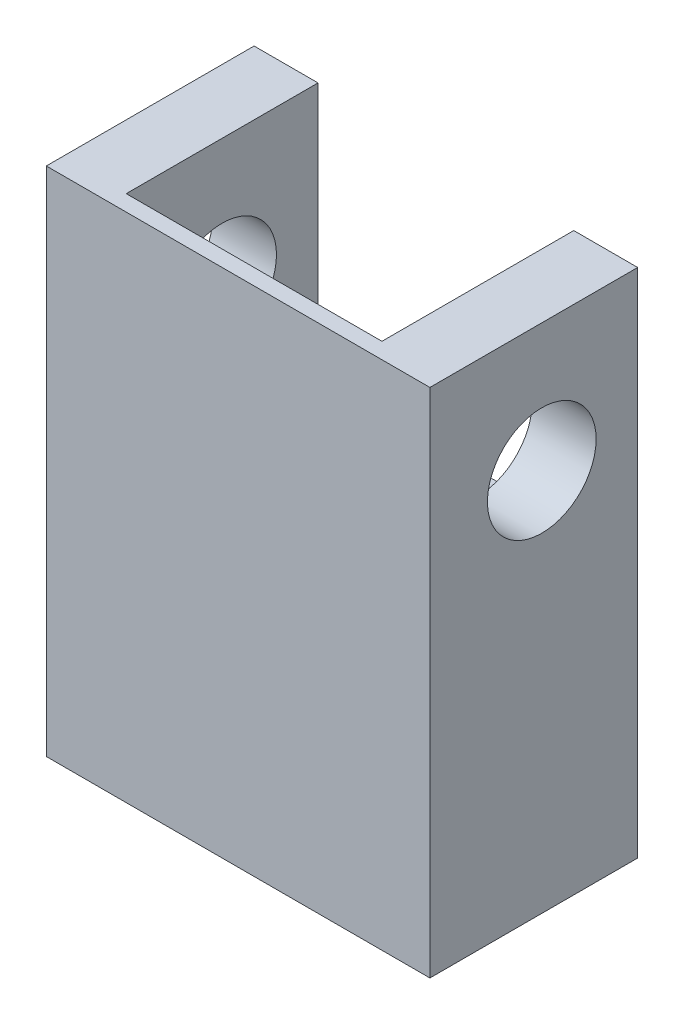
ISO-10303-21;
HEADER;
FILE_DESCRIPTION(('STEP AP214'),'2;1');
FILE_NAME('part.step','',(''),(''),'','','');
FILE_SCHEMA(('AUTOMOTIVE_DESIGN { 1 0 10303 214 1 1 1 1 }'));
ENDSEC;
DATA;
#1=APPLICATION_CONTEXT('core data for automotive mechanical design processes');
#2=APPLICATION_PROTOCOL_DEFINITION('international standard','automotive_design',2000,#1);
#3=PRODUCT_CONTEXT('',#1,'mechanical');
#4=PRODUCT('Part','Part','',(#3));
#5=PRODUCT_RELATED_PRODUCT_CATEGORY('part','',(#4));
#6=PRODUCT_DEFINITION_FORMATION('','',#4);
#7=PRODUCT_DEFINITION_CONTEXT('part definition',#1,'design');
#8=PRODUCT_DEFINITION('design','',#6,#7);
#9=PRODUCT_DEFINITION_SHAPE('','',#8);
#10=(LENGTH_UNIT() NAMED_UNIT(*) SI_UNIT(.MILLI.,.METRE.));
#11=(NAMED_UNIT(*) PLANE_ANGLE_UNIT() SI_UNIT($,.RADIAN.));
#12=(NAMED_UNIT(*) SI_UNIT($,.STERADIAN.) SOLID_ANGLE_UNIT());
#13=UNCERTAINTY_MEASURE_WITH_UNIT(LENGTH_MEASURE(1.E-05),#10,'distance_accuracy_value','');
#14=(GEOMETRIC_REPRESENTATION_CONTEXT(3) GLOBAL_UNCERTAINTY_ASSIGNED_CONTEXT((#13)) GLOBAL_UNIT_ASSIGNED_CONTEXT((#10,
#11,#12)) REPRESENTATION_CONTEXT('',''));
#15=CARTESIAN_POINT('',(0.,0.,0.));
#16=DIRECTION('',(0.,0.,1.));
#17=DIRECTION('',(1.,0.,0.));
#18=AXIS2_PLACEMENT_3D('',#15,#16,#17);
#19=CARTESIAN_POINT('',(38.1,0.,19.05));
#20=DIRECTION('',(-1.,0.,0.));
#21=DIRECTION('',(0.,-1.,0.));
#22=AXIS2_PLACEMENT_3D('',#19,#20,#21);
#23=PLANE('',#22);
#24=CARTESIAN_POINT('',(38.1,76.2,0.));
#25=DIRECTION('',(1.,0.,0.));
#26=DIRECTION('',(0.,0.,-1.));
#27=AXIS2_PLACEMENT_3D('',#24,#25,#26);
#28=CIRCLE('',#27,10.795);
#29=CARTESIAN_POINT('',(38.1,76.2,-10.795));
#30=VERTEX_POINT('',#29);
#31=EDGE_CURVE('E130',#30,#30,#28,.T.);
#32=ORIENTED_EDGE('',*,*,#31,.F.);
#33=EDGE_LOOP('',(#32));
#34=FACE_BOUND('',#33,.T.);
#35=DIRECTION('',(0.,1.,0.));
#36=VECTOR('',#35,1.);
#37=CARTESIAN_POINT('',(38.1,0.,-19.05));
#38=LINE('',#37,#36);
#39=CARTESIAN_POINT('',(38.1,0.,-19.05));
#40=VERTEX_POINT('',#39);
#41=CARTESIAN_POINT('',(38.1,101.6,-19.05));
#42=VERTEX_POINT('',#41);
#43=EDGE_CURVE('E143',#40,#42,#38,.T.);
#44=ORIENTED_EDGE('',*,*,#43,.T.);
#45=DIRECTION('',(0.,0.,-1.));
#46=VECTOR('',#45,1.);
#47=CARTESIAN_POINT('',(38.1,101.6,19.05));
#48=LINE('',#47,#46);
#49=CARTESIAN_POINT('',(38.1,101.6,22.225));
#50=VERTEX_POINT('',#49);
#51=EDGE_CURVE('E11',#50,#42,#48,.T.);
#52=ORIENTED_EDGE('',*,*,#51,.F.);
#53=DIRECTION('',(0.,1.,0.));
#54=VECTOR('',#53,1.);
#55=CARTESIAN_POINT('',(38.1,101.6,22.225));
#56=LINE('',#55,#54);
#57=CARTESIAN_POINT('',(38.1,0.,22.225));
#58=VERTEX_POINT('',#57);
#59=EDGE_CURVE('E119',#58,#50,#56,.T.);
#60=ORIENTED_EDGE('',*,*,#59,.F.);
#61=DIRECTION('',(0.,0.,-1.));
#62=VECTOR('',#61,1.);
#63=CARTESIAN_POINT('',(38.1,0.,19.05));
#64=LINE('',#63,#62);
#65=EDGE_CURVE('E111',#58,#40,#64,.T.);
#66=ORIENTED_EDGE('',*,*,#65,.T.);
#67=EDGE_LOOP('',(#44,#52,#60,#66));
#68=FACE_BOUND('',#67,.T.);
#69=ADVANCED_FACE('F33',(#34,#68),#23,.F.);
#70=CARTESIAN_POINT('',(25.4,101.6,19.05));
#71=DIRECTION('',(1.,0.,0.));
#72=DIRECTION('',(0.,0.,-1.));
#73=AXIS2_PLACEMENT_3D('',#70,#71,#72);
#74=PLANE('',#73);
#75=CARTESIAN_POINT('',(25.4,76.2,0.));
#76=DIRECTION('',(1.,0.,0.));
#77=DIRECTION('',(0.,0.,-1.));
#78=AXIS2_PLACEMENT_3D('',#75,#76,#77);
#79=CIRCLE('',#78,10.795);
#80=CARTESIAN_POINT('',(25.4,76.2,-10.795));
#81=VERTEX_POINT('',#80);
#82=EDGE_CURVE('E140',#81,#81,#79,.T.);
#83=ORIENTED_EDGE('',*,*,#82,.T.);
#84=EDGE_LOOP('',(#83));
#85=FACE_BOUND('',#84,.T.);
#86=DIRECTION('',(0.,-1.,0.));
#87=VECTOR('',#86,1.);
#88=CARTESIAN_POINT('',(25.4,101.6,-19.05));
#89=LINE('',#88,#87);
#90=CARTESIAN_POINT('',(25.4,101.6,-19.05));
#91=VERTEX_POINT('',#90);
#92=CARTESIAN_POINT('',(25.4,50.8,-19.05));
#93=VERTEX_POINT('',#92);
#94=EDGE_CURVE('E157',#91,#93,#89,.T.);
#95=ORIENTED_EDGE('',*,*,#94,.T.);
#96=DIRECTION('',(0.,0.,-1.));
#97=VECTOR('',#96,1.);
#98=CARTESIAN_POINT('',(25.4,50.8,19.05));
#99=LINE('',#98,#97);
#100=CARTESIAN_POINT('',(25.4,50.8,19.05));
#101=VERTEX_POINT('',#100);
#102=EDGE_CURVE('E173',#101,#93,#99,.T.);
#103=ORIENTED_EDGE('',*,*,#102,.F.);
#104=DIRECTION('',(0.,-1.,0.));
#105=VECTOR('',#104,1.);
#106=CARTESIAN_POINT('',(25.4,101.6,19.05));
#107=LINE('',#106,#105);
#108=CARTESIAN_POINT('',(25.4,101.6,19.05));
#109=VERTEX_POINT('',#108);
#110=EDGE_CURVE('E144',#109,#101,#107,.T.);
#111=ORIENTED_EDGE('',*,*,#110,.F.);
#112=DIRECTION('',(0.,0.,-1.));
#113=VECTOR('',#112,1.);
#114=CARTESIAN_POINT('',(25.4,101.6,19.05));
#115=LINE('',#114,#113);
#116=EDGE_CURVE('E41',#109,#91,#115,.T.);
#117=ORIENTED_EDGE('',*,*,#116,.T.);
#118=EDGE_LOOP('',(#95,#103,#111,#117));
#119=FACE_BOUND('',#118,.T.);
#120=ADVANCED_FACE('F177',(#85,#119),#74,.F.);
#121=CARTESIAN_POINT('',(25.4,50.8,19.05));
#122=DIRECTION('',(0.,-1.,0.));
#123=DIRECTION('',(1.,0.,0.));
#124=AXIS2_PLACEMENT_3D('',#121,#122,#123);
#125=PLANE('',#124);
#126=DIRECTION('',(-1.,0.,0.));
#127=VECTOR('',#126,1.);
#128=CARTESIAN_POINT('',(25.4,50.8,-19.05));
#129=LINE('',#128,#127);
#130=CARTESIAN_POINT('',(-25.4,50.8,-19.05));
#131=VERTEX_POINT('',#130);
#132=EDGE_CURVE('E159',#93,#131,#129,.T.);
#133=ORIENTED_EDGE('',*,*,#132,.T.);
#134=DIRECTION('',(0.,0.,-1.));
#135=VECTOR('',#134,1.);
#136=CARTESIAN_POINT('',(-25.4,50.8,19.05));
#137=LINE('',#136,#135);
#138=CARTESIAN_POINT('',(-25.4,50.8,19.05));
#139=VERTEX_POINT('',#138);
#140=EDGE_CURVE('E49',#139,#131,#137,.T.);
#141=ORIENTED_EDGE('',*,*,#140,.F.);
#142=DIRECTION('',(-1.,0.,0.));
#143=VECTOR('',#142,1.);
#144=CARTESIAN_POINT('',(25.4,50.8,19.05));
#145=LINE('',#144,#143);
#146=EDGE_CURVE('E147',#101,#139,#145,.T.);
#147=ORIENTED_EDGE('',*,*,#146,.F.);
#148=ORIENTED_EDGE('',*,*,#102,.T.);
#149=EDGE_LOOP('',(#133,#141,#147,#148));
#150=FACE_BOUND('',#149,.T.);
#151=ADVANCED_FACE('F185',(#150),#125,.F.);
#152=CARTESIAN_POINT('',(-25.4,101.6,19.05));
#153=DIRECTION('',(-1.,0.,0.));
#154=DIRECTION('',(0.,-1.,0.));
#155=AXIS2_PLACEMENT_3D('',#152,#153,#154);
#156=PLANE('',#155);
#157=CARTESIAN_POINT('',(-25.4,76.2,0.));
#158=DIRECTION('',(-1.,0.,0.));
#159=DIRECTION('',(0.,-1.,0.));
#160=AXIS2_PLACEMENT_3D('',#157,#158,#159);
#161=CIRCLE('',#160,10.795);
#162=CARTESIAN_POINT('',(-25.4,65.405,0.));
#163=VERTEX_POINT('',#162);
#164=EDGE_CURVE('E137',#163,#163,#161,.T.);
#165=ORIENTED_EDGE('',*,*,#164,.T.);
#166=EDGE_LOOP('',(#165));
#167=FACE_BOUND('',#166,.T.);
#168=DIRECTION('',(0.,1.,0.));
#169=VECTOR('',#168,1.);
#170=CARTESIAN_POINT('',(-25.4,101.6,-19.05));
#171=LINE('',#170,#169);
#172=CARTESIAN_POINT('',(-25.4,101.6,-19.05));
#173=VERTEX_POINT('',#172);
#174=EDGE_CURVE('E161',#131,#173,#171,.T.);
#175=ORIENTED_EDGE('',*,*,#174,.T.);
#176=DIRECTION('',(0.,0.,-1.));
#177=VECTOR('',#176,1.);
#178=CARTESIAN_POINT('',(-25.4,101.6,19.05));
#179=LINE('',#178,#177);
#180=CARTESIAN_POINT('',(-25.4,101.6,19.05));
#181=VERTEX_POINT('',#180);
#182=EDGE_CURVE('E169',#181,#173,#179,.T.);
#183=ORIENTED_EDGE('',*,*,#182,.F.);
#184=DIRECTION('',(0.,1.,0.));
#185=VECTOR('',#184,1.);
#186=CARTESIAN_POINT('',(-25.4,101.6,19.05));
#187=LINE('',#186,#185);
#188=EDGE_CURVE('E150',#139,#181,#187,.T.);
#189=ORIENTED_EDGE('',*,*,#188,.F.);
#190=ORIENTED_EDGE('',*,*,#140,.T.);
#191=EDGE_LOOP('',(#175,#183,#189,#190));
#192=FACE_BOUND('',#191,.T.);
#193=ADVANCED_FACE('F187',(#167,#192),#156,.F.);
#194=CARTESIAN_POINT('',(-38.1,101.6,19.05));
#195=DIRECTION('',(0.,-1.,0.));
#196=DIRECTION('',(1.,0.,0.));
#197=AXIS2_PLACEMENT_3D('',#194,#195,#196);
#198=PLANE('',#197);
#199=DIRECTION('',(-1.,0.,0.));
#200=VECTOR('',#199,1.);
#201=CARTESIAN_POINT('',(-38.1,101.6,-19.05));
#202=LINE('',#201,#200);
#203=CARTESIAN_POINT('',(-38.1,101.6,-19.05));
#204=VERTEX_POINT('',#203);
#205=EDGE_CURVE('E163',#173,#204,#202,.T.);
#206=ORIENTED_EDGE('',*,*,#205,.T.);
#207=DIRECTION('',(0.,0.,-1.));
#208=VECTOR('',#207,1.);
#209=CARTESIAN_POINT('',(-38.1,101.6,19.05));
#210=LINE('',#209,#208);
#211=CARTESIAN_POINT('',(-38.1,101.6,22.225));
#212=VERTEX_POINT('',#211);
#213=EDGE_CURVE('E110',#212,#204,#210,.T.);
#214=ORIENTED_EDGE('',*,*,#213,.F.);
#215=DIRECTION('',(-1.,0.,0.));
#216=VECTOR('',#215,1.);
#217=CARTESIAN_POINT('',(-38.1,101.6,22.225));
#218=LINE('',#217,#216);
#219=EDGE_CURVE('E124',#50,#212,#218,.T.);
#220=ORIENTED_EDGE('',*,*,#219,.F.);
#221=ORIENTED_EDGE('',*,*,#51,.T.);
#222=DIRECTION('',(-1.,0.,0.));
#223=VECTOR('',#222,1.);
#224=CARTESIAN_POINT('',(38.1,101.6,-19.05));
#225=LINE('',#224,#223);
#226=EDGE_CURVE('E155',#42,#91,#225,.T.);
#227=ORIENTED_EDGE('',*,*,#226,.T.);
#228=ORIENTED_EDGE('',*,*,#116,.F.);
#229=DIRECTION('',(-1.,0.,0.));
#230=VECTOR('',#229,1.);
#231=CARTESIAN_POINT('',(-38.1,101.6,19.05));
#232=LINE('',#231,#230);
#233=EDGE_CURVE('E125',#109,#181,#232,.T.);
#234=ORIENTED_EDGE('',*,*,#233,.T.);
#235=ORIENTED_EDGE('',*,*,#182,.T.);
#236=EDGE_LOOP('',(#206,#214,#220,#221,#227,#228,#234,#235));
#237=FACE_BOUND('',#236,.T.);
#238=ADVANCED_FACE('F190',(#237),#198,.F.);
#239=CARTESIAN_POINT('',(-38.1,0.,19.05));
#240=DIRECTION('',(1.,0.,0.));
#241=DIRECTION('',(0.,1.,0.));
#242=AXIS2_PLACEMENT_3D('',#239,#240,#241);
#243=PLANE('',#242);
#244=CARTESIAN_POINT('',(-38.1,76.2,0.));
#245=DIRECTION('',(1.,0.,0.));
#246=DIRECTION('',(0.,0.,-1.));
#247=AXIS2_PLACEMENT_3D('',#244,#245,#246);
#248=CIRCLE('',#247,10.795);
#249=CARTESIAN_POINT('',(-38.1,76.2,-10.795));
#250=VERTEX_POINT('',#249);
#251=EDGE_CURVE('E134',#250,#250,#248,.T.);
#252=ORIENTED_EDGE('',*,*,#251,.T.);
#253=EDGE_LOOP('',(#252));
#254=FACE_BOUND('',#253,.T.);
#255=DIRECTION('',(0.,-1.,0.));
#256=VECTOR('',#255,1.);
#257=CARTESIAN_POINT('',(-38.1,0.,-19.05));
#258=LINE('',#257,#256);
#259=CARTESIAN_POINT('',(-38.1,0.,-19.05));
#260=VERTEX_POINT('',#259);
#261=EDGE_CURVE('E79',#204,#260,#258,.T.);
#262=ORIENTED_EDGE('',*,*,#261,.T.);
#263=DIRECTION('',(0.,0.,-1.));
#264=VECTOR('',#263,1.);
#265=CARTESIAN_POINT('',(-38.1,0.,19.05));
#266=LINE('',#265,#264);
#267=CARTESIAN_POINT('',(-38.1,0.,22.225));
#268=VERTEX_POINT('',#267);
#269=EDGE_CURVE('E105',#268,#260,#266,.T.);
#270=ORIENTED_EDGE('',*,*,#269,.F.);
#271=DIRECTION('',(0.,-1.,0.));
#272=VECTOR('',#271,1.);
#273=CARTESIAN_POINT('',(-38.1,101.6,22.225));
#274=LINE('',#273,#272);
#275=EDGE_CURVE('E109',#212,#268,#274,.T.);
#276=ORIENTED_EDGE('',*,*,#275,.F.);
#277=ORIENTED_EDGE('',*,*,#213,.T.);
#278=EDGE_LOOP('',(#262,#270,#276,#277));
#279=FACE_BOUND('',#278,.T.);
#280=ADVANCED_FACE('F107',(#254,#279),#243,.F.);
#281=CARTESIAN_POINT('',(-38.1,0.,19.05));
#282=DIRECTION('',(0.,1.,0.));
#283=DIRECTION('',(-1.,0.,0.));
#284=AXIS2_PLACEMENT_3D('',#281,#282,#283);
#285=PLANE('',#284);
#286=DIRECTION('',(1.,0.,0.));
#287=VECTOR('',#286,1.);
#288=CARTESIAN_POINT('',(-38.1,0.,-19.05));
#289=LINE('',#288,#287);
#290=EDGE_CURVE('E85',#260,#40,#289,.T.);
#291=ORIENTED_EDGE('',*,*,#290,.T.);
#292=ORIENTED_EDGE('',*,*,#65,.F.);
#293=DIRECTION('',(1.,0.,0.));
#294=VECTOR('',#293,1.);
#295=CARTESIAN_POINT('',(-38.1,0.,22.225));
#296=LINE('',#295,#294);
#297=EDGE_CURVE('E114',#268,#58,#296,.T.);
#298=ORIENTED_EDGE('',*,*,#297,.F.);
#299=ORIENTED_EDGE('',*,*,#269,.T.);
#300=EDGE_LOOP('',(#291,#292,#298,#299));
#301=FACE_BOUND('',#300,.T.);
#302=ADVANCED_FACE('F115',(#301),#285,.F.);
#303=CARTESIAN_POINT('',(0.,0.,-19.05));
#304=DIRECTION('',(0.,0.,1.));
#305=DIRECTION('',(1.,0.,0.));
#306=AXIS2_PLACEMENT_3D('',#303,#304,#305);
#307=PLANE('',#306);
#308=ORIENTED_EDGE('',*,*,#43,.F.);
#309=ORIENTED_EDGE('',*,*,#290,.F.);
#310=ORIENTED_EDGE('',*,*,#261,.F.);
#311=ORIENTED_EDGE('',*,*,#205,.F.);
#312=ORIENTED_EDGE('',*,*,#174,.F.);
#313=ORIENTED_EDGE('',*,*,#132,.F.);
#314=ORIENTED_EDGE('',*,*,#94,.F.);
#315=ORIENTED_EDGE('',*,*,#226,.F.);
#316=EDGE_LOOP('',(#308,#309,#310,#311,#312,#313,#314,#315));
#317=FACE_BOUND('',#316,.T.);
#318=ADVANCED_FACE('F182',(#317),#307,.F.);
#319=CARTESIAN_POINT('',(-38.1,76.2,0.));
#320=DIRECTION('',(1.,0.,0.));
#321=DIRECTION('',(0.,0.,-1.));
#322=AXIS2_PLACEMENT_3D('',#319,#320,#321);
#323=CYLINDRICAL_SURFACE('',#322,10.795);
#324=ORIENTED_EDGE('',*,*,#251,.F.);
#325=EDGE_LOOP('',(#324));
#326=FACE_BOUND('',#325,.T.);
#327=ORIENTED_EDGE('',*,*,#164,.F.);
#328=EDGE_LOOP('',(#327));
#329=FACE_BOUND('',#328,.T.);
#330=ADVANCED_FACE('F203',(#326,#329),#323,.F.);
#331=ORIENTED_EDGE('',*,*,#31,.T.);
#332=EDGE_LOOP('',(#331));
#333=FACE_BOUND('',#332,.T.);
#334=ORIENTED_EDGE('',*,*,#82,.F.);
#335=EDGE_LOOP('',(#334));
#336=FACE_BOUND('',#335,.T.);
#337=ADVANCED_FACE('F200',(#333,#336),#323,.F.);
#338=CARTESIAN_POINT('',(0.,0.,19.05));
#339=DIRECTION('',(0.,0.,1.));
#340=DIRECTION('',(1.,0.,0.));
#341=AXIS2_PLACEMENT_3D('',#338,#339,#340);
#342=PLANE('',#341);
#343=ORIENTED_EDGE('',*,*,#233,.F.);
#344=ORIENTED_EDGE('',*,*,#110,.T.);
#345=ORIENTED_EDGE('',*,*,#146,.T.);
#346=ORIENTED_EDGE('',*,*,#188,.T.);
#347=EDGE_LOOP('',(#343,#344,#345,#346));
#348=FACE_BOUND('',#347,.T.);
#349=ADVANCED_FACE('F189',(#348),#342,.F.);
#350=CARTESIAN_POINT('',(0.,0.,22.225));
#351=DIRECTION('',(0.,0.,1.));
#352=DIRECTION('',(1.,0.,0.));
#353=AXIS2_PLACEMENT_3D('',#350,#351,#352);
#354=PLANE('',#353);
#355=ORIENTED_EDGE('',*,*,#275,.T.);
#356=ORIENTED_EDGE('',*,*,#297,.T.);
#357=ORIENTED_EDGE('',*,*,#59,.T.);
#358=ORIENTED_EDGE('',*,*,#219,.T.);
#359=EDGE_LOOP('',(#355,#356,#357,#358));
#360=FACE_BOUND('',#359,.T.);
#361=ADVANCED_FACE('F122',(#360),#354,.T.);
#362=CLOSED_SHELL('',(#69,#120,#151,#193,#238,#280,#302,#318,#330,#337,#349,#361));
#363=MANIFOLD_SOLID_BREP('B2',#362);
#364=ADVANCED_BREP_SHAPE_REPRESENTATION('',(#18,#363),#14);
#365=SHAPE_DEFINITION_REPRESENTATION(#9,#364);
ENDSEC;
END-ISO-10303-21;
